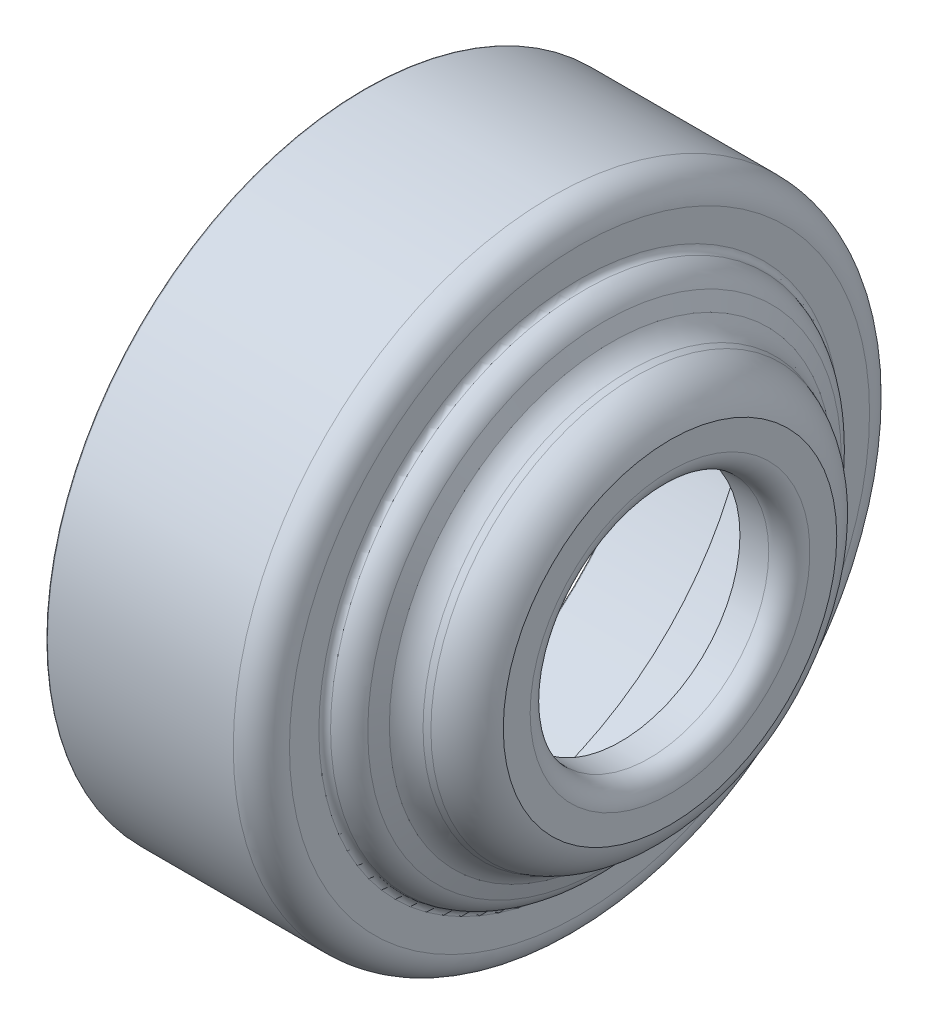
ISO-10303-21;
HEADER;
FILE_DESCRIPTION(('STEP AP214'),'2;1');
FILE_NAME('part.step','',(''),(''),'','','');
FILE_SCHEMA(('AUTOMOTIVE_DESIGN { 1 0 10303 214 1 1 1 1 }'));
ENDSEC;
DATA;
#1=APPLICATION_CONTEXT('core data for automotive mechanical design processes');
#2=APPLICATION_PROTOCOL_DEFINITION('international standard','automotive_design',2000,#1);
#3=PRODUCT_CONTEXT('',#1,'mechanical');
#4=PRODUCT('Part','Part','',(#3));
#5=PRODUCT_RELATED_PRODUCT_CATEGORY('part','',(#4));
#6=PRODUCT_DEFINITION_FORMATION('','',#4);
#7=PRODUCT_DEFINITION_CONTEXT('part definition',#1,'design');
#8=PRODUCT_DEFINITION('design','',#6,#7);
#9=PRODUCT_DEFINITION_SHAPE('','',#8);
#10=(LENGTH_UNIT() NAMED_UNIT(*) SI_UNIT(.MILLI.,.METRE.));
#11=(NAMED_UNIT(*) PLANE_ANGLE_UNIT() SI_UNIT($,.RADIAN.));
#12=(NAMED_UNIT(*) SI_UNIT($,.STERADIAN.) SOLID_ANGLE_UNIT());
#13=UNCERTAINTY_MEASURE_WITH_UNIT(LENGTH_MEASURE(1.E-05),#10,'distance_accuracy_value','');
#14=(GEOMETRIC_REPRESENTATION_CONTEXT(3) GLOBAL_UNCERTAINTY_ASSIGNED_CONTEXT((#13)) GLOBAL_UNIT_ASSIGNED_CONTEXT((#10,
#11,#12)) REPRESENTATION_CONTEXT('',''));
#15=CARTESIAN_POINT('',(0.,0.,0.));
#16=DIRECTION('',(0.,0.,1.));
#17=DIRECTION('',(1.,0.,0.));
#18=AXIS2_PLACEMENT_3D('',#15,#16,#17);
#19=CARTESIAN_POINT('',(-14.9,23.2,0.));
#20=DIRECTION('',(1.,0.,0.));
#21=DIRECTION('',(0.,0.,-1.));
#22=AXIS2_PLACEMENT_3D('',#19,#20,#21);
#23=PLANE('',#22);
#24=CARTESIAN_POINT('',(-14.9,0.,0.));
#25=DIRECTION('',(1.,0.,0.));
#26=DIRECTION('',(0.,0.,-1.));
#27=AXIS2_PLACEMENT_3D('',#24,#25,#26);
#28=CIRCLE('',#27,22.1);
#29=CARTESIAN_POINT('',(-14.9,0.,-22.1));
#30=VERTEX_POINT('',#29);
#31=EDGE_CURVE('E39',#30,#30,#28,.T.);
#32=ORIENTED_EDGE('',*,*,#31,.T.);
#33=EDGE_LOOP('',(#32));
#34=FACE_BOUND('',#33,.T.);
#35=CARTESIAN_POINT('',(-14.9,0.,0.));
#36=DIRECTION('',(1.,0.,0.));
#37=DIRECTION('',(0.,0.,-1.));
#38=AXIS2_PLACEMENT_3D('',#35,#36,#37);
#39=CIRCLE('',#38,23.1);
#40=CARTESIAN_POINT('',(-14.9,0.,-23.1));
#41=VERTEX_POINT('',#40);
#42=EDGE_CURVE('E43',#41,#41,#39,.F.);
#43=ORIENTED_EDGE('',*,*,#42,.T.);
#44=EDGE_LOOP('',(#43));
#45=FACE_BOUND('',#44,.T.);
#46=ADVANCED_FACE('F32',(#34,#45),#23,.F.);
#47=CARTESIAN_POINT('',(-28.9724854245721,0.,0.));
#48=DIRECTION('',(-1.,0.,0.));
#49=DIRECTION('',(0.,0.,1.));
#50=AXIS2_PLACEMENT_3D('',#47,#48,#49);
#51=CYLINDRICAL_SURFACE('',#50,22.);
#52=CARTESIAN_POINT('',(-14.8,0.,0.));
#53=DIRECTION('',(1.,0.,0.));
#54=DIRECTION('',(0.,0.,-1.));
#55=AXIS2_PLACEMENT_3D('',#52,#53,#54);
#56=CIRCLE('',#55,22.);
#57=CARTESIAN_POINT('',(-14.8,0.,-22.));
#58=VERTEX_POINT('',#57);
#59=EDGE_CURVE('E47',#58,#58,#56,.F.);
#60=ORIENTED_EDGE('',*,*,#59,.T.);
#61=EDGE_LOOP('',(#60));
#62=FACE_BOUND('',#61,.T.);
#63=CARTESIAN_POINT('',(-7.9,0.,0.));
#64=DIRECTION('',(-1.,0.,0.));
#65=DIRECTION('',(0.,0.,1.));
#66=AXIS2_PLACEMENT_3D('',#63,#64,#65);
#67=CIRCLE('',#66,22.);
#68=CARTESIAN_POINT('',(-7.9,0.,22.));
#69=VERTEX_POINT('',#68);
#70=EDGE_CURVE('E52',#69,#69,#67,.T.);
#71=ORIENTED_EDGE('',*,*,#70,.F.);
#72=EDGE_LOOP('',(#71));
#73=FACE_BOUND('',#72,.T.);
#74=ADVANCED_FACE('F289',(#62,#73),#51,.F.);
#75=CARTESIAN_POINT('',(-7.9,22.,0.));
#76=DIRECTION('',(1.,0.,0.));
#77=DIRECTION('',(0.,0.,-1.));
#78=AXIS2_PLACEMENT_3D('',#75,#76,#77);
#79=PLANE('',#78);
#80=CARTESIAN_POINT('',(-7.9,0.,0.));
#81=DIRECTION('',(-1.,0.,0.));
#82=DIRECTION('',(0.,0.,1.));
#83=AXIS2_PLACEMENT_3D('',#80,#81,#82);
#84=CIRCLE('',#83,21.4);
#85=CARTESIAN_POINT('',(-7.9,0.,21.4));
#86=VERTEX_POINT('',#85);
#87=EDGE_CURVE('E55',#86,#86,#84,.T.);
#88=ORIENTED_EDGE('',*,*,#87,.F.);
#89=EDGE_LOOP('',(#88));
#90=FACE_BOUND('',#89,.T.);
#91=ORIENTED_EDGE('',*,*,#70,.T.);
#92=EDGE_LOOP('',(#91));
#93=FACE_BOUND('',#92,.T.);
#94=ADVANCED_FACE('F283',(#90,#93),#79,.F.);
#95=CARTESIAN_POINT('',(-28.9724854245721,0.,0.));
#96=DIRECTION('',(-1.,0.,0.));
#97=DIRECTION('',(0.,0.,1.));
#98=AXIS2_PLACEMENT_3D('',#95,#96,#97);
#99=CYLINDRICAL_SURFACE('',#98,21.4);
#100=CARTESIAN_POINT('',(-0.899999999999998,0.,0.));
#101=DIRECTION('',(-1.,0.,0.));
#102=DIRECTION('',(0.,0.,1.));
#103=AXIS2_PLACEMENT_3D('',#100,#101,#102);
#104=CIRCLE('',#103,21.4);
#105=CARTESIAN_POINT('',(-0.899999999999998,0.,21.4));
#106=VERTEX_POINT('',#105);
#107=EDGE_CURVE('E58',#106,#106,#104,.T.);
#108=ORIENTED_EDGE('',*,*,#107,.F.);
#109=EDGE_LOOP('',(#108));
#110=FACE_BOUND('',#109,.T.);
#111=ORIENTED_EDGE('',*,*,#87,.T.);
#112=EDGE_LOOP('',(#111));
#113=FACE_BOUND('',#112,.T.);
#114=ADVANCED_FACE('F277',(#110,#113),#99,.F.);
#115=CARTESIAN_POINT('',(-0.899999999999997,0.,0.));
#116=DIRECTION('',(-1.,0.,0.));
#117=DIRECTION('',(0.,0.,1.));
#118=AXIS2_PLACEMENT_3D('',#115,#116,#117);
#119=TOROIDAL_SURFACE('',#118,20.9,0.499999999999998);
#120=CARTESIAN_POINT('',(-0.399999999999998,0.,0.));
#121=DIRECTION('',(-1.,0.,0.));
#122=DIRECTION('',(0.,0.,1.));
#123=AXIS2_PLACEMENT_3D('',#120,#121,#122);
#124=CIRCLE('',#123,20.9);
#125=CARTESIAN_POINT('',(-0.399999999999998,0.,20.9));
#126=VERTEX_POINT('',#125);
#127=EDGE_CURVE('E61',#126,#126,#124,.T.);
#128=ORIENTED_EDGE('',*,*,#127,.F.);
#129=EDGE_LOOP('',(#128));
#130=FACE_BOUND('',#129,.T.);
#131=ORIENTED_EDGE('',*,*,#107,.T.);
#132=EDGE_LOOP('',(#131));
#133=FACE_BOUND('',#132,.T.);
#134=ADVANCED_FACE('F271',(#130,#133),#119,.F.);
#135=CARTESIAN_POINT('',(-0.399999999999998,20.9,0.));
#136=DIRECTION('',(1.,0.,0.));
#137=DIRECTION('',(0.,0.,-1.));
#138=AXIS2_PLACEMENT_3D('',#135,#136,#137);
#139=PLANE('',#138);
#140=CARTESIAN_POINT('',(-0.399999999999998,0.,0.));
#141=DIRECTION('',(-1.,0.,0.));
#142=DIRECTION('',(0.,0.,1.));
#143=AXIS2_PLACEMENT_3D('',#140,#141,#142);
#144=CIRCLE('',#143,17.7);
#145=CARTESIAN_POINT('',(-0.399999999999998,0.,17.7));
#146=VERTEX_POINT('',#145);
#147=EDGE_CURVE('E64',#146,#146,#144,.T.);
#148=ORIENTED_EDGE('',*,*,#147,.F.);
#149=EDGE_LOOP('',(#148));
#150=FACE_BOUND('',#149,.T.);
#151=ORIENTED_EDGE('',*,*,#127,.T.);
#152=EDGE_LOOP('',(#151));
#153=FACE_BOUND('',#152,.T.);
#154=ADVANCED_FACE('F265',(#150,#153),#139,.F.);
#155=CARTESIAN_POINT('',(-0.0999999999999973,0.,0.));
#156=DIRECTION('',(-1.,0.,0.));
#157=DIRECTION('',(0.,0.,1.));
#158=AXIS2_PLACEMENT_3D('',#155,#156,#157);
#159=TOROIDAL_SURFACE('',#158,17.7,0.300000000000001);
#160=CARTESIAN_POINT('',(-0.0999999999999959,0.,0.));
#161=DIRECTION('',(-1.,0.,0.));
#162=DIRECTION('',(0.,0.,1.));
#163=AXIS2_PLACEMENT_3D('',#160,#161,#162);
#164=CIRCLE('',#163,17.4);
#165=CARTESIAN_POINT('',(-0.0999999999999959,0.,17.4));
#166=VERTEX_POINT('',#165);
#167=EDGE_CURVE('E67',#166,#166,#164,.T.);
#168=ORIENTED_EDGE('',*,*,#167,.F.);
#169=EDGE_LOOP('',(#168));
#170=FACE_BOUND('',#169,.T.);
#171=ORIENTED_EDGE('',*,*,#147,.T.);
#172=EDGE_LOOP('',(#171));
#173=FACE_BOUND('',#172,.T.);
#174=ADVANCED_FACE('F259',(#170,#173),#159,.T.);
#175=CARTESIAN_POINT('',(-28.9724854245721,0.,0.));
#176=DIRECTION('',(-1.,0.,0.));
#177=DIRECTION('',(0.,0.,1.));
#178=AXIS2_PLACEMENT_3D('',#175,#176,#177);
#179=CYLINDRICAL_SURFACE('',#178,17.4);
#180=CARTESIAN_POINT('',(0.600000000000003,0.,0.));
#181=DIRECTION('',(-1.,0.,0.));
#182=DIRECTION('',(0.,0.,1.));
#183=AXIS2_PLACEMENT_3D('',#180,#181,#182);
#184=CIRCLE('',#183,17.4);
#185=CARTESIAN_POINT('',(0.600000000000003,0.,17.4));
#186=VERTEX_POINT('',#185);
#187=EDGE_CURVE('E70',#186,#186,#184,.T.);
#188=ORIENTED_EDGE('',*,*,#187,.F.);
#189=EDGE_LOOP('',(#188));
#190=FACE_BOUND('',#189,.T.);
#191=ORIENTED_EDGE('',*,*,#167,.T.);
#192=EDGE_LOOP('',(#191));
#193=FACE_BOUND('',#192,.T.);
#194=ADVANCED_FACE('F253',(#190,#193),#179,.F.);
#195=CARTESIAN_POINT('',(0.601981361931688,0.,0.));
#196=DIRECTION('',(-1.,0.,0.));
#197=DIRECTION('',(0.,0.,1.));
#198=AXIS2_PLACEMENT_3D('',#195,#196,#197);
#199=TOROIDAL_SURFACE('',#198,16.4000019628995,1.);
#200=CARTESIAN_POINT('',(1.52069821576387,0.,0.));
#201=DIRECTION('',(-1.,0.,0.));
#202=DIRECTION('',(0.,0.,1.));
#203=AXIS2_PLACEMENT_3D('',#200,#201,#202);
#204=CIRCLE('',#203,16.7949188433752);
#205=CARTESIAN_POINT('',(1.52069821576387,0.,16.7949188433752));
#206=VERTEX_POINT('',#205);
#207=EDGE_CURVE('E73',#206,#206,#204,.T.);
#208=ORIENTED_EDGE('',*,*,#207,.F.);
#209=EDGE_LOOP('',(#208));
#210=FACE_BOUND('',#209,.T.);
#211=ORIENTED_EDGE('',*,*,#187,.T.);
#212=EDGE_LOOP('',(#211));
#213=FACE_BOUND('',#212,.T.);
#214=ADVANCED_FACE('F247',(#210,#213),#199,.F.);
#215=CARTESIAN_POINT('',(1.52069821576387,0.,0.));
#216=DIRECTION('',(-1.,0.,0.));
#217=DIRECTION('',(0.,0.,1.));
#218=AXIS2_PLACEMENT_3D('',#215,#216,#217);
#219=CONICAL_SURFACE('',#218,16.7949188433752,1.1693705988362);
#220=CARTESIAN_POINT('',(2.02193494607727,0.,0.));
#221=DIRECTION('',(-1.,0.,0.));
#222=DIRECTION('',(0.,0.,1.));
#223=AXIS2_PLACEMENT_3D('',#220,#221,#222);
#224=CIRCLE('',#223,15.6140791064286);
#225=CARTESIAN_POINT('',(2.02193494607727,0.,15.6140791064286));
#226=VERTEX_POINT('',#225);
#227=EDGE_CURVE('E76',#226,#226,#224,.T.);
#228=ORIENTED_EDGE('',*,*,#227,.F.);
#229=EDGE_LOOP('',(#228));
#230=FACE_BOUND('',#229,.T.);
#231=ORIENTED_EDGE('',*,*,#207,.T.);
#232=EDGE_LOOP('',(#231));
#233=FACE_BOUND('',#232,.T.);
#234=ADVANCED_FACE('F241',(#230,#233),#219,.F.);
#235=CARTESIAN_POINT('',(5.38571216961617,0.,0.));
#236=DIRECTION('',(-1.,0.,0.));
#237=DIRECTION('',(0.,0.,1.));
#238=AXIS2_PLACEMENT_3D('',#235,#236,#237);
#239=TOROIDAL_SURFACE('',#238,17.5808166444888,3.89654382154419);
#240=CARTESIAN_POINT('',(4.02426123459067,0.,0.));
#241=DIRECTION('',(-1.,0.,0.));
#242=DIRECTION('',(0.,0.,1.));
#243=AXIS2_PLACEMENT_3D('',#240,#241,#242);
#244=CIRCLE('',#243,13.92985716721);
#245=CARTESIAN_POINT('',(4.02426123459067,0.,13.92985716721));
#246=VERTEX_POINT('',#245);
#247=EDGE_CURVE('E79',#246,#246,#244,.T.);
#248=ORIENTED_EDGE('',*,*,#247,.F.);
#249=EDGE_LOOP('',(#248));
#250=FACE_BOUND('',#249,.T.);
#251=ORIENTED_EDGE('',*,*,#227,.T.);
#252=EDGE_LOOP('',(#251));
#253=FACE_BOUND('',#252,.T.);
#254=ADVANCED_FACE('F235',(#250,#253),#239,.T.);
#255=CARTESIAN_POINT('',(4.02426123459067,0.,0.));
#256=DIRECTION('',(-1.,0.,0.));
#257=DIRECTION('',(0.,0.,1.));
#258=AXIS2_PLACEMENT_3D('',#255,#256,#257);
#259=CONICAL_SURFACE('',#258,13.92985716721,0.356930263272574);
#260=CARTESIAN_POINT('',(4.46608341092177,0.,0.));
#261=DIRECTION('',(-1.,0.,0.));
#262=DIRECTION('',(0.,0.,1.));
#263=AXIS2_PLACEMENT_3D('',#260,#261,#262);
#264=CIRCLE('',#263,13.7651006918713);
#265=CARTESIAN_POINT('',(4.46608341092177,0.,13.7651006918713));
#266=VERTEX_POINT('',#265);
#267=EDGE_CURVE('E82',#266,#266,#264,.T.);
#268=ORIENTED_EDGE('',*,*,#267,.F.);
#269=EDGE_LOOP('',(#268));
#270=FACE_BOUND('',#269,.T.);
#271=ORIENTED_EDGE('',*,*,#247,.T.);
#272=EDGE_LOOP('',(#271));
#273=FACE_BOUND('',#272,.T.);
#274=ADVANCED_FACE('F229',(#270,#273),#259,.F.);
#275=CARTESIAN_POINT('',(3.65724851185547,0.,0.));
#276=DIRECTION('',(-1.,0.,0.));
#277=DIRECTION('',(0.,0.,1.));
#278=AXIS2_PLACEMENT_3D('',#275,#276,#277);
#279=TOROIDAL_SURFACE('',#278,11.2363634560668,2.6549436720374);
#280=CARTESIAN_POINT('',(6.2,0.,0.));
#281=DIRECTION('',(-1.,0.,0.));
#282=DIRECTION('',(0.,0.,1.));
#283=AXIS2_PLACEMENT_3D('',#280,#281,#282);
#284=CIRCLE('',#283,12.);
#285=CARTESIAN_POINT('',(6.2,0.,12.));
#286=VERTEX_POINT('',#285);
#287=EDGE_CURVE('E85',#286,#286,#284,.T.);
#288=ORIENTED_EDGE('',*,*,#287,.F.);
#289=EDGE_LOOP('',(#288));
#290=FACE_BOUND('',#289,.T.);
#291=ORIENTED_EDGE('',*,*,#267,.T.);
#292=EDGE_LOOP('',(#291));
#293=FACE_BOUND('',#292,.T.);
#294=ADVANCED_FACE('F223',(#290,#293),#279,.F.);
#295=CARTESIAN_POINT('',(6.2,12.,0.));
#296=DIRECTION('',(1.,0.,0.));
#297=DIRECTION('',(0.,0.,-1.));
#298=AXIS2_PLACEMENT_3D('',#295,#296,#297);
#299=PLANE('',#298);
#300=CARTESIAN_POINT('',(6.2,0.,0.));
#301=DIRECTION('',(-1.,0.,0.));
#302=DIRECTION('',(0.,0.,1.));
#303=AXIS2_PLACEMENT_3D('',#300,#301,#302);
#304=CIRCLE('',#303,9.89999999999999);
#305=CARTESIAN_POINT('',(6.2,0.,9.89999999999999));
#306=VERTEX_POINT('',#305);
#307=EDGE_CURVE('E88',#306,#306,#304,.T.);
#308=ORIENTED_EDGE('',*,*,#307,.F.);
#309=EDGE_LOOP('',(#308));
#310=FACE_BOUND('',#309,.T.);
#311=ORIENTED_EDGE('',*,*,#287,.T.);
#312=EDGE_LOOP('',(#311));
#313=FACE_BOUND('',#312,.T.);
#314=ADVANCED_FACE('F217',(#310,#313),#299,.F.);
#315=CARTESIAN_POINT('',(5.7,0.,0.));
#316=DIRECTION('',(-1.,0.,0.));
#317=DIRECTION('',(0.,0.,1.));
#318=AXIS2_PLACEMENT_3D('',#315,#316,#317);
#319=TOROIDAL_SURFACE('',#318,9.89999999999999,0.499999999999999);
#320=CARTESIAN_POINT('',(5.7,0.,0.));
#321=DIRECTION('',(-1.,0.,0.));
#322=DIRECTION('',(0.,0.,1.));
#323=AXIS2_PLACEMENT_3D('',#320,#321,#322);
#324=CIRCLE('',#323,9.39999999999999);
#325=CARTESIAN_POINT('',(5.7,0.,9.39999999999999));
#326=VERTEX_POINT('',#325);
#327=EDGE_CURVE('E91',#326,#326,#324,.T.);
#328=ORIENTED_EDGE('',*,*,#327,.F.);
#329=EDGE_LOOP('',(#328));
#330=FACE_BOUND('',#329,.T.);
#331=ORIENTED_EDGE('',*,*,#307,.T.);
#332=EDGE_LOOP('',(#331));
#333=FACE_BOUND('',#332,.T.);
#334=ADVANCED_FACE('F211',(#330,#333),#319,.F.);
#335=CARTESIAN_POINT('',(-28.9724854245721,0.,0.));
#336=DIRECTION('',(-1.,0.,0.));
#337=DIRECTION('',(0.,0.,1.));
#338=AXIS2_PLACEMENT_3D('',#335,#336,#337);
#339=CYLINDRICAL_SURFACE('',#338,9.39999999999999);
#340=CARTESIAN_POINT('',(3.8,0.,0.));
#341=DIRECTION('',(-1.,0.,0.));
#342=DIRECTION('',(0.,0.,1.));
#343=AXIS2_PLACEMENT_3D('',#340,#341,#342);
#344=CIRCLE('',#343,9.39999999999999);
#345=CARTESIAN_POINT('',(3.8,0.,9.39999999999999));
#346=VERTEX_POINT('',#345);
#347=EDGE_CURVE('E94',#346,#346,#344,.T.);
#348=ORIENTED_EDGE('',*,*,#347,.F.);
#349=EDGE_LOOP('',(#348));
#350=FACE_BOUND('',#349,.T.);
#351=ORIENTED_EDGE('',*,*,#327,.T.);
#352=EDGE_LOOP('',(#351));
#353=FACE_BOUND('',#352,.T.);
#354=ADVANCED_FACE('F205',(#350,#353),#339,.T.);
#355=CARTESIAN_POINT('',(3.8,9.39999999999999,0.));
#356=DIRECTION('',(1.,0.,0.));
#357=DIRECTION('',(0.,0.,-1.));
#358=AXIS2_PLACEMENT_3D('',#355,#356,#357);
#359=PLANE('',#358);
#360=CARTESIAN_POINT('',(3.8,0.,0.));
#361=DIRECTION('',(-1.,0.,0.));
#362=DIRECTION('',(0.,0.,1.));
#363=AXIS2_PLACEMENT_3D('',#360,#361,#362);
#364=CIRCLE('',#363,8.69999999999999);
#365=CARTESIAN_POINT('',(3.8,0.,8.69999999999999));
#366=VERTEX_POINT('',#365);
#367=EDGE_CURVE('E97',#366,#366,#364,.T.);
#368=ORIENTED_EDGE('',*,*,#367,.F.);
#369=EDGE_LOOP('',(#368));
#370=FACE_BOUND('',#369,.T.);
#371=ORIENTED_EDGE('',*,*,#347,.T.);
#372=EDGE_LOOP('',(#371));
#373=FACE_BOUND('',#372,.T.);
#374=ADVANCED_FACE('F199',(#370,#373),#359,.F.);
#375=CARTESIAN_POINT('',(-28.9724854245721,0.,0.));
#376=DIRECTION('',(-1.,0.,0.));
#377=DIRECTION('',(0.,0.,1.));
#378=AXIS2_PLACEMENT_3D('',#375,#376,#377);
#379=CYLINDRICAL_SURFACE('',#378,8.69999999999999);
#380=CARTESIAN_POINT('',(5.9,0.,0.));
#381=DIRECTION('',(-1.,0.,0.));
#382=DIRECTION('',(0.,0.,1.));
#383=AXIS2_PLACEMENT_3D('',#380,#381,#382);
#384=CIRCLE('',#383,8.69999999999999);
#385=CARTESIAN_POINT('',(5.9,0.,8.69999999999999));
#386=VERTEX_POINT('',#385);
#387=EDGE_CURVE('E100',#386,#386,#384,.T.);
#388=ORIENTED_EDGE('',*,*,#387,.F.);
#389=EDGE_LOOP('',(#388));
#390=FACE_BOUND('',#389,.T.);
#391=ORIENTED_EDGE('',*,*,#367,.T.);
#392=EDGE_LOOP('',(#391));
#393=FACE_BOUND('',#392,.T.);
#394=ADVANCED_FACE('F193',(#390,#393),#379,.F.);
#395=CARTESIAN_POINT('',(5.9,0.,0.));
#396=DIRECTION('',(-1.,0.,0.));
#397=DIRECTION('',(0.,0.,1.));
#398=AXIS2_PLACEMENT_3D('',#395,#396,#397);
#399=TOROIDAL_SURFACE('',#398,10.2,1.5);
#400=CARTESIAN_POINT('',(7.4,0.,0.));
#401=DIRECTION('',(-1.,0.,0.));
#402=DIRECTION('',(0.,0.,1.));
#403=AXIS2_PLACEMENT_3D('',#400,#401,#402);
#404=CIRCLE('',#403,10.2);
#405=CARTESIAN_POINT('',(7.4,0.,10.2));
#406=VERTEX_POINT('',#405);
#407=EDGE_CURVE('E103',#406,#406,#404,.T.);
#408=ORIENTED_EDGE('',*,*,#407,.F.);
#409=EDGE_LOOP('',(#408));
#410=FACE_BOUND('',#409,.T.);
#411=ORIENTED_EDGE('',*,*,#387,.T.);
#412=EDGE_LOOP('',(#411));
#413=FACE_BOUND('',#412,.T.);
#414=ADVANCED_FACE('F187',(#410,#413),#399,.T.);
#415=CARTESIAN_POINT('',(7.4,12.1596196570062,0.));
#416=DIRECTION('',(-1.,0.,0.));
#417=DIRECTION('',(0.,0.,1.));
#418=AXIS2_PLACEMENT_3D('',#415,#416,#417);
#419=PLANE('',#418);
#420=CARTESIAN_POINT('',(7.4,0.,0.));
#421=DIRECTION('',(-1.,0.,0.));
#422=DIRECTION('',(0.,0.,1.));
#423=AXIS2_PLACEMENT_3D('',#420,#421,#422);
#424=CIRCLE('',#423,12.1596196570062);
#425=CARTESIAN_POINT('',(7.4,0.,12.1596196570062));
#426=VERTEX_POINT('',#425);
#427=EDGE_CURVE('E106',#426,#426,#424,.T.);
#428=ORIENTED_EDGE('',*,*,#427,.F.);
#429=EDGE_LOOP('',(#428));
#430=FACE_BOUND('',#429,.T.);
#431=ORIENTED_EDGE('',*,*,#407,.T.);
#432=EDGE_LOOP('',(#431));
#433=FACE_BOUND('',#432,.T.);
#434=ADVANCED_FACE('F181',(#430,#433),#419,.F.);
#435=CARTESIAN_POINT('',(3.65724851185547,0.,0.));
#436=DIRECTION('',(-1.,0.,0.));
#437=DIRECTION('',(0.,0.,1.));
#438=AXIS2_PLACEMENT_3D('',#435,#436,#437);
#439=TOROIDAL_SURFACE('',#438,11.2363634560668,3.8549436720374);
#440=CARTESIAN_POINT('',(4.86121133594503,0.,0.));
#441=DIRECTION('',(-1.,0.,0.));
#442=DIRECTION('',(0.,0.,1.));
#443=AXIS2_PLACEMENT_3D('',#440,#441,#442);
#444=CIRCLE('',#443,14.8984754468164);
#445=CARTESIAN_POINT('',(4.86121133594503,0.,14.8984754468164));
#446=VERTEX_POINT('',#445);
#447=EDGE_CURVE('E109',#446,#446,#444,.T.);
#448=ORIENTED_EDGE('',*,*,#447,.F.);
#449=EDGE_LOOP('',(#448));
#450=FACE_BOUND('',#449,.T.);
#451=ORIENTED_EDGE('',*,*,#427,.T.);
#452=EDGE_LOOP('',(#451));
#453=FACE_BOUND('',#452,.T.);
#454=ADVANCED_FACE('F175',(#450,#453),#439,.T.);
#455=CARTESIAN_POINT('',(4.86121133594503,0.,0.));
#456=DIRECTION('',(-1.,0.,0.));
#457=DIRECTION('',(0.,0.,1.));
#458=AXIS2_PLACEMENT_3D('',#455,#456,#457);
#459=CONICAL_SURFACE('',#458,14.8984754468164,0.356930263272583);
#460=CARTESIAN_POINT('',(4.44354077996562,0.,0.));
#461=DIRECTION('',(-1.,0.,0.));
#462=DIRECTION('',(0.,0.,1.));
#463=AXIS2_PLACEMENT_3D('',#460,#461,#462);
#464=CIRCLE('',#463,15.0542257290393);
#465=CARTESIAN_POINT('',(4.44354077996562,0.,15.0542257290393));
#466=VERTEX_POINT('',#465);
#467=EDGE_CURVE('E112',#466,#466,#464,.T.);
#468=ORIENTED_EDGE('',*,*,#467,.F.);
#469=EDGE_LOOP('',(#468));
#470=FACE_BOUND('',#469,.T.);
#471=ORIENTED_EDGE('',*,*,#447,.T.);
#472=EDGE_LOOP('',(#471));
#473=FACE_BOUND('',#472,.T.);
#474=ADVANCED_FACE('F169',(#470,#473),#459,.T.);
#475=CARTESIAN_POINT('',(5.38571216961617,0.,0.));
#476=DIRECTION('',(-1.,0.,0.));
#477=DIRECTION('',(0.,0.,1.));
#478=AXIS2_PLACEMENT_3D('',#475,#476,#477);
#479=TOROIDAL_SURFACE('',#478,17.5808166444888,2.69654382154419);
#480=CARTESIAN_POINT('',(3.09380938830858,0.,0.));
#481=DIRECTION('',(-1.,0.,0.));
#482=DIRECTION('',(0.,0.,1.));
#483=AXIS2_PLACEMENT_3D('',#480,#481,#482);
#484=CIRCLE('',#483,16.160066764129);
#485=CARTESIAN_POINT('',(3.09380938830858,0.,16.160066764129));
#486=VERTEX_POINT('',#485);
#487=EDGE_CURVE('E115',#486,#486,#484,.T.);
#488=ORIENTED_EDGE('',*,*,#487,.F.);
#489=EDGE_LOOP('',(#488));
#490=FACE_BOUND('',#489,.T.);
#491=ORIENTED_EDGE('',*,*,#467,.T.);
#492=EDGE_LOOP('',(#491));
#493=FACE_BOUND('',#492,.T.);
#494=ADVANCED_FACE('F163',(#490,#493),#479,.F.);
#495=CARTESIAN_POINT('',(3.09380938830858,0.,0.));
#496=DIRECTION('',(-1.,0.,0.));
#497=DIRECTION('',(0.,0.,1.));
#498=AXIS2_PLACEMENT_3D('',#495,#496,#497);
#499=CONICAL_SURFACE('',#498,16.160066764129,1.1693705988362);
#500=CARTESIAN_POINT('',(2.62444461160248,0.,0.));
#501=DIRECTION('',(-1.,0.,0.));
#502=DIRECTION('',(0.,0.,1.));
#503=AXIS2_PLACEMENT_3D('',#500,#501,#502);
#504=CIRCLE('',#503,17.2658208837663);
#505=CARTESIAN_POINT('',(2.62444461160248,0.,17.2658208837663));
#506=VERTEX_POINT('',#505);
#507=EDGE_CURVE('E118',#506,#506,#504,.T.);
#508=ORIENTED_EDGE('',*,*,#507,.F.);
#509=EDGE_LOOP('',(#508));
#510=FACE_BOUND('',#509,.T.);
#511=ORIENTED_EDGE('',*,*,#487,.T.);
#512=EDGE_LOOP('',(#511));
#513=FACE_BOUND('',#512,.T.);
#514=ADVANCED_FACE('F157',(#510,#513),#499,.T.);
#515=CARTESIAN_POINT('',(0.601981361931688,0.,0.));
#516=DIRECTION('',(-1.,0.,0.));
#517=DIRECTION('',(0.,0.,1.));
#518=AXIS2_PLACEMENT_3D('',#515,#516,#517);
#519=TOROIDAL_SURFACE('',#518,16.4000019628995,2.2);
#520=CARTESIAN_POINT('',(1.17073728924661,0.,0.));
#521=DIRECTION('',(-1.,0.,0.));
#522=DIRECTION('',(0.,0.,1.));
#523=AXIS2_PLACEMENT_3D('',#520,#521,#522);
#524=CIRCLE('',#523,18.5252117631649);
#525=CARTESIAN_POINT('',(1.17073728924661,0.,18.5252117631649));
#526=VERTEX_POINT('',#525);
#527=EDGE_CURVE('E121',#526,#526,#524,.T.);
#528=ORIENTED_EDGE('',*,*,#527,.F.);
#529=EDGE_LOOP('',(#528));
#530=FACE_BOUND('',#529,.T.);
#531=ORIENTED_EDGE('',*,*,#507,.T.);
#532=EDGE_LOOP('',(#531));
#533=FACE_BOUND('',#532,.T.);
#534=ADVANCED_FACE('F151',(#530,#533),#519,.T.);
#535=CARTESIAN_POINT('',(1.3,0.,0.));
#536=DIRECTION('',(-1.,0.,0.));
#537=DIRECTION('',(0.,0.,1.));
#538=AXIS2_PLACEMENT_3D('',#535,#536,#537);
#539=TOROIDAL_SURFACE('',#538,19.0082139904979,0.5);
#540=CARTESIAN_POINT('',(0.800000000000002,0.,0.));
#541=DIRECTION('',(-1.,0.,0.));
#542=DIRECTION('',(0.,0.,1.));
#543=AXIS2_PLACEMENT_3D('',#540,#541,#542);
#544=CIRCLE('',#543,19.0082139904979);
#545=CARTESIAN_POINT('',(0.800000000000002,0.,19.0082139904979));
#546=VERTEX_POINT('',#545);
#547=EDGE_CURVE('E124',#546,#546,#544,.T.);
#548=ORIENTED_EDGE('',*,*,#547,.F.);
#549=EDGE_LOOP('',(#548));
#550=FACE_BOUND('',#549,.T.);
#551=ORIENTED_EDGE('',*,*,#527,.T.);
#552=EDGE_LOOP('',(#551));
#553=FACE_BOUND('',#552,.T.);
#554=ADVANCED_FACE('F145',(#550,#553),#539,.F.);
#555=CARTESIAN_POINT('',(0.800000000000001,21.15,0.));
#556=DIRECTION('',(-1.,0.,0.));
#557=DIRECTION('',(0.,0.,1.));
#558=AXIS2_PLACEMENT_3D('',#555,#556,#557);
#559=PLANE('',#558);
#560=CARTESIAN_POINT('',(0.799999999999999,0.,0.));
#561=DIRECTION('',(-1.,0.,0.));
#562=DIRECTION('',(0.,0.,1.));
#563=AXIS2_PLACEMENT_3D('',#560,#561,#562);
#564=CIRCLE('',#563,21.15);
#565=CARTESIAN_POINT('',(0.799999999999999,0.,21.15));
#566=VERTEX_POINT('',#565);
#567=EDGE_CURVE('E127',#566,#566,#564,.T.);
#568=ORIENTED_EDGE('',*,*,#567,.F.);
#569=EDGE_LOOP('',(#568));
#570=FACE_BOUND('',#569,.T.);
#571=ORIENTED_EDGE('',*,*,#547,.T.);
#572=EDGE_LOOP('',(#571));
#573=FACE_BOUND('',#572,.T.);
#574=ADVANCED_FACE('F139',(#570,#573),#559,.F.);
#575=CARTESIAN_POINT('',(-1.25,0.,0.));
#576=DIRECTION('',(-1.,0.,0.));
#577=DIRECTION('',(0.,0.,1.));
#578=AXIS2_PLACEMENT_3D('',#575,#576,#577);
#579=TOROIDAL_SURFACE('',#578,21.15,2.05);
#580=CARTESIAN_POINT('',(-1.25000000000001,0.,0.));
#581=DIRECTION('',(-1.,0.,0.));
#582=DIRECTION('',(0.,0.,1.));
#583=AXIS2_PLACEMENT_3D('',#580,#581,#582);
#584=CIRCLE('',#583,23.2);
#585=CARTESIAN_POINT('',(-1.25000000000001,0.,23.2));
#586=VERTEX_POINT('',#585);
#587=EDGE_CURVE('E130',#586,#586,#584,.T.);
#588=ORIENTED_EDGE('',*,*,#587,.F.);
#589=EDGE_LOOP('',(#588));
#590=FACE_BOUND('',#589,.T.);
#591=ORIENTED_EDGE('',*,*,#567,.T.);
#592=EDGE_LOOP('',(#591));
#593=FACE_BOUND('',#592,.T.);
#594=ADVANCED_FACE('F136',(#590,#593),#579,.T.);
#595=CARTESIAN_POINT('',(-28.9724854245721,0.,0.));
#596=DIRECTION('',(-1.,0.,0.));
#597=DIRECTION('',(0.,0.,1.));
#598=AXIS2_PLACEMENT_3D('',#595,#596,#597);
#599=CYLINDRICAL_SURFACE('',#598,23.2);
#600=CARTESIAN_POINT('',(-14.8,0.,0.));
#601=DIRECTION('',(1.,0.,0.));
#602=DIRECTION('',(0.,0.,-1.));
#603=AXIS2_PLACEMENT_3D('',#600,#601,#602);
#604=CIRCLE('',#603,23.2);
#605=CARTESIAN_POINT('',(-14.8,0.,-23.2));
#606=VERTEX_POINT('',#605);
#607=EDGE_CURVE('E10',#606,#606,#604,.T.);
#608=ORIENTED_EDGE('',*,*,#607,.T.);
#609=EDGE_LOOP('',(#608));
#610=FACE_BOUND('',#609,.T.);
#611=ORIENTED_EDGE('',*,*,#587,.T.);
#612=EDGE_LOOP('',(#611));
#613=FACE_BOUND('',#612,.T.);
#614=ADVANCED_FACE('F134',(#610,#613),#599,.T.);
#615=CARTESIAN_POINT('',(-14.8,0.,0.));
#616=DIRECTION('',(1.,0.,0.));
#617=DIRECTION('',(0.,0.,-1.));
#618=AXIS2_PLACEMENT_3D('',#615,#616,#617);
#619=TOROIDAL_SURFACE('',#618,22.1,0.1);
#620=ORIENTED_EDGE('',*,*,#31,.F.);
#621=EDGE_LOOP('',(#620));
#622=FACE_BOUND('',#621,.T.);
#623=ORIENTED_EDGE('',*,*,#59,.F.);
#624=EDGE_LOOP('',(#623));
#625=FACE_BOUND('',#624,.T.);
#626=ADVANCED_FACE('F300',(#622,#625),#619,.T.);
#627=CARTESIAN_POINT('',(-14.8,0.,0.));
#628=DIRECTION('',(1.,0.,0.));
#629=DIRECTION('',(0.,0.,-1.));
#630=AXIS2_PLACEMENT_3D('',#627,#628,#629);
#631=TOROIDAL_SURFACE('',#630,23.1,0.1);
#632=ORIENTED_EDGE('',*,*,#607,.F.);
#633=EDGE_LOOP('',(#632));
#634=FACE_BOUND('',#633,.T.);
#635=ORIENTED_EDGE('',*,*,#42,.F.);
#636=EDGE_LOOP('',(#635));
#637=FACE_BOUND('',#636,.T.);
#638=ADVANCED_FACE('F34',(#634,#637),#631,.T.);
#639=CLOSED_SHELL('',(#46,#74,#94,#114,#134,#154,#174,#194,#214,#234,#254,#274,#294,#314,#334,
#354,#374,#394,#414,#434,#454,#474,#494,#514,#534,#554,#574,#594,#614,#626,#638));
#640=MANIFOLD_SOLID_BREP('B2',#639);
#641=ADVANCED_BREP_SHAPE_REPRESENTATION('',(#18,#640),#14);
#642=SHAPE_DEFINITION_REPRESENTATION(#9,#641);
ENDSEC;
END-ISO-10303-21;
